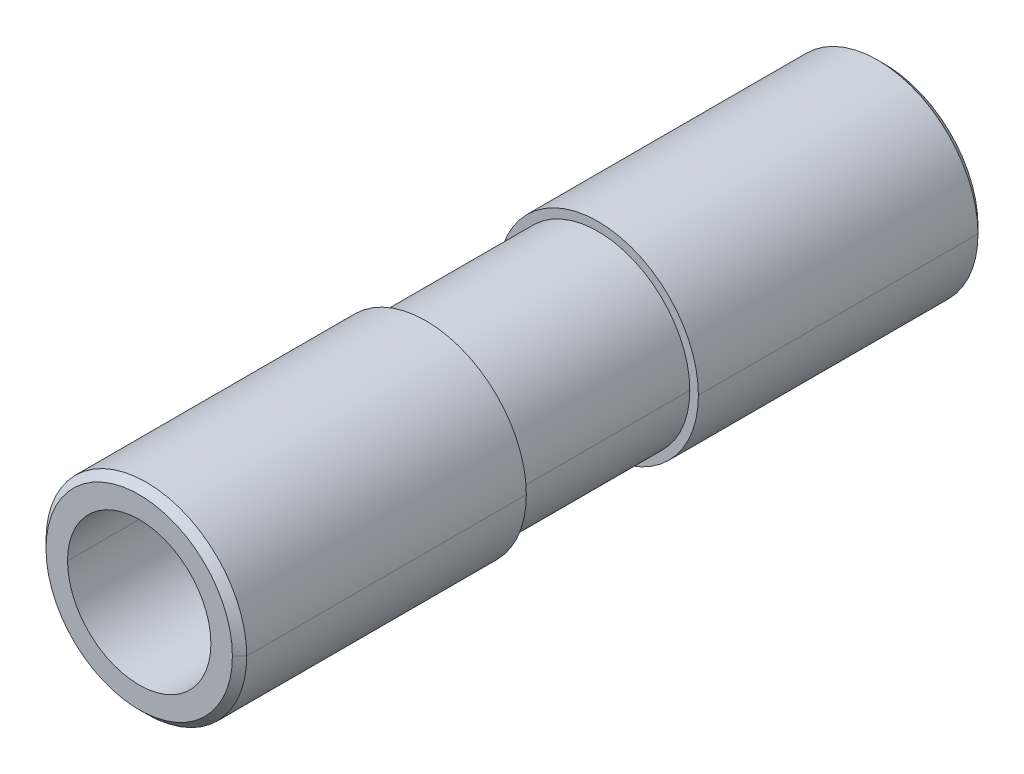
ISO-10303-21;
HEADER;
FILE_DESCRIPTION(('STEP AP214'),'2;1');
FILE_NAME('part.step','',(''),(''),'','','');
FILE_SCHEMA(('AUTOMOTIVE_DESIGN { 1 0 10303 214 1 1 1 1 }'));
ENDSEC;
DATA;
#1=APPLICATION_CONTEXT('core data for automotive mechanical design processes');
#2=APPLICATION_PROTOCOL_DEFINITION('international standard','automotive_design',2000,#1);
#3=PRODUCT_CONTEXT('',#1,'mechanical');
#4=PRODUCT('Part','Part','',(#3));
#5=PRODUCT_RELATED_PRODUCT_CATEGORY('part','',(#4));
#6=PRODUCT_DEFINITION_FORMATION('','',#4);
#7=PRODUCT_DEFINITION_CONTEXT('part definition',#1,'design');
#8=PRODUCT_DEFINITION('design','',#6,#7);
#9=PRODUCT_DEFINITION_SHAPE('','',#8);
#10=(LENGTH_UNIT() NAMED_UNIT(*) SI_UNIT(.MILLI.,.METRE.));
#11=(NAMED_UNIT(*) PLANE_ANGLE_UNIT() SI_UNIT($,.RADIAN.));
#12=(NAMED_UNIT(*) SI_UNIT($,.STERADIAN.) SOLID_ANGLE_UNIT());
#13=UNCERTAINTY_MEASURE_WITH_UNIT(LENGTH_MEASURE(1.E-05),#10,'distance_accuracy_value','');
#14=(GEOMETRIC_REPRESENTATION_CONTEXT(3) GLOBAL_UNCERTAINTY_ASSIGNED_CONTEXT((#13)) GLOBAL_UNIT_ASSIGNED_CONTEXT((#10,
#11,#12)) REPRESENTATION_CONTEXT('',''));
#15=CARTESIAN_POINT('',(0.,0.,0.));
#16=DIRECTION('',(0.,0.,1.));
#17=DIRECTION('',(1.,0.,0.));
#18=AXIS2_PLACEMENT_3D('',#15,#16,#17);
#19=CARTESIAN_POINT('',(0.,0.,13.));
#20=DIRECTION('',(0.,0.,-1.));
#21=DIRECTION('',(-1.,0.,0.));
#22=AXIS2_PLACEMENT_3D('',#19,#20,#21);
#23=CONICAL_SURFACE('',#22,3.25,0.785398163397449);
#24=CARTESIAN_POINT('',(0.,0.,13.));
#25=DIRECTION('',(0.,0.,1.));
#26=DIRECTION('',(-1.,0.,0.));
#27=AXIS2_PLACEMENT_3D('',#24,#25,#26);
#28=CIRCLE('',#27,3.25);
#29=CARTESIAN_POINT('',(3.25,0.,13.));
#30=VERTEX_POINT('',#29);
#31=CARTESIAN_POINT('',(-3.25,0.,13.));
#32=VERTEX_POINT('',#31);
#33=EDGE_CURVE('E41',#30,#32,#28,.T.);
#34=ORIENTED_EDGE('',*,*,#33,.F.);
#35=DIRECTION('',(0.707106781186548,0.,-0.707106781186547));
#36=VECTOR('',#35,1.);
#37=CARTESIAN_POINT('',(3.25,0.,13.));
#38=LINE('',#37,#36);
#39=CARTESIAN_POINT('',(3.5,0.,12.75));
#40=VERTEX_POINT('',#39);
#41=EDGE_CURVE('E11',#30,#40,#38,.T.);
#42=ORIENTED_EDGE('',*,*,#41,.T.);
#43=CARTESIAN_POINT('',(0.,0.,12.75));
#44=DIRECTION('',(0.,0.,-1.));
#45=DIRECTION('',(-1.,0.,0.));
#46=AXIS2_PLACEMENT_3D('',#43,#44,#45);
#47=CIRCLE('',#46,3.5);
#48=CARTESIAN_POINT('',(-3.5,0.,12.75));
#49=VERTEX_POINT('',#48);
#50=EDGE_CURVE('E123',#49,#40,#47,.T.);
#51=ORIENTED_EDGE('',*,*,#50,.F.);
#52=DIRECTION('',(-0.707106781186548,0.,-0.707106781186547));
#53=VECTOR('',#52,1.);
#54=CARTESIAN_POINT('',(-3.25,0.,13.));
#55=LINE('',#54,#53);
#56=EDGE_CURVE('E166',#32,#49,#55,.T.);
#57=ORIENTED_EDGE('',*,*,#56,.F.);
#58=EDGE_LOOP('',(#34,#42,#51,#57));
#59=FACE_BOUND('',#58,.T.);
#60=ADVANCED_FACE('F16',(#59),#23,.T.);
#61=CARTESIAN_POINT('',(0.,0.,-12.75));
#62=DIRECTION('',(0.,0.,1.));
#63=DIRECTION('',(1.,0.,0.));
#64=AXIS2_PLACEMENT_3D('',#61,#62,#63);
#65=CONICAL_SURFACE('',#64,3.5,0.785398163397448);
#66=CARTESIAN_POINT('',(0.,0.,-13.));
#67=DIRECTION('',(0.,0.,-1.));
#68=DIRECTION('',(1.,0.,0.));
#69=AXIS2_PLACEMENT_3D('',#66,#67,#68);
#70=CIRCLE('',#69,3.25);
#71=CARTESIAN_POINT('',(-3.25,0.,-13.));
#72=VERTEX_POINT('',#71);
#73=CARTESIAN_POINT('',(3.25,0.,-13.));
#74=VERTEX_POINT('',#73);
#75=EDGE_CURVE('E192',#72,#74,#70,.T.);
#76=ORIENTED_EDGE('',*,*,#75,.F.);
#77=DIRECTION('',(-0.707106781186548,0.,0.707106781186548));
#78=VECTOR('',#77,1.);
#79=CARTESIAN_POINT('',(-3.5,0.,-12.75));
#80=LINE('',#79,#78);
#81=CARTESIAN_POINT('',(-3.5,0.,-12.75));
#82=VERTEX_POINT('',#81);
#83=EDGE_CURVE('E27',#72,#82,#80,.T.);
#84=ORIENTED_EDGE('',*,*,#83,.T.);
#85=CARTESIAN_POINT('',(0.,0.,-12.75));
#86=DIRECTION('',(0.,0.,1.));
#87=DIRECTION('',(1.,0.,0.));
#88=AXIS2_PLACEMENT_3D('',#85,#86,#87);
#89=CIRCLE('',#88,3.5);
#90=CARTESIAN_POINT('',(3.5,0.,-12.75));
#91=VERTEX_POINT('',#90);
#92=EDGE_CURVE('E180',#91,#82,#89,.T.);
#93=ORIENTED_EDGE('',*,*,#92,.F.);
#94=DIRECTION('',(0.707106781186548,0.,0.707106781186548));
#95=VECTOR('',#94,1.);
#96=CARTESIAN_POINT('',(3.5,0.,-12.75));
#97=LINE('',#96,#95);
#98=EDGE_CURVE('E162',#74,#91,#97,.T.);
#99=ORIENTED_EDGE('',*,*,#98,.F.);
#100=EDGE_LOOP('',(#76,#84,#93,#99));
#101=FACE_BOUND('',#100,.T.);
#102=ADVANCED_FACE('F254',(#101),#65,.T.);
#103=CARTESIAN_POINT('',(0.,0.,7.75955985725057));
#104=DIRECTION('',(0.,0.,1.));
#105=DIRECTION('',(1.,0.,0.));
#106=AXIS2_PLACEMENT_3D('',#103,#104,#105);
#107=CYLINDRICAL_SURFACE('',#106,3.5);
#108=ORIENTED_EDGE('',*,*,#92,.T.);
#109=DIRECTION('',(0.,0.,1.));
#110=VECTOR('',#109,1.);
#111=CARTESIAN_POINT('',(-3.5,0.,7.75955985725057));
#112=LINE('',#111,#110);
#113=CARTESIAN_POINT('',(-3.5,0.,-3.));
#114=VERTEX_POINT('',#113);
#115=EDGE_CURVE('E209',#82,#114,#112,.T.);
#116=ORIENTED_EDGE('',*,*,#115,.T.);
#117=CARTESIAN_POINT('',(0.,0.,-3.));
#118=DIRECTION('',(0.,0.,1.));
#119=DIRECTION('',(1.,0.,0.));
#120=AXIS2_PLACEMENT_3D('',#117,#118,#119);
#121=CIRCLE('',#120,3.5);
#122=CARTESIAN_POINT('',(3.5,0.,-3.));
#123=VERTEX_POINT('',#122);
#124=EDGE_CURVE('E176',#123,#114,#121,.T.);
#125=ORIENTED_EDGE('',*,*,#124,.F.);
#126=DIRECTION('',(0.,0.,1.));
#127=VECTOR('',#126,1.);
#128=CARTESIAN_POINT('',(3.5,0.,7.75955985725057));
#129=LINE('',#128,#127);
#130=EDGE_CURVE('E172',#91,#123,#129,.T.);
#131=ORIENTED_EDGE('',*,*,#130,.F.);
#132=EDGE_LOOP('',(#108,#116,#125,#131));
#133=FACE_BOUND('',#132,.T.);
#134=ADVANCED_FACE('F248',(#133),#107,.T.);
#135=CARTESIAN_POINT('',(0.,0.,7.75955985725057));
#136=DIRECTION('',(0.,0.,1.));
#137=DIRECTION('',(1.,0.,0.));
#138=AXIS2_PLACEMENT_3D('',#135,#136,#137);
#139=CYLINDRICAL_SURFACE('',#138,3.2);
#140=CARTESIAN_POINT('',(0.,0.,-3.));
#141=DIRECTION('',(0.,0.,1.));
#142=DIRECTION('',(1.,0.,0.));
#143=AXIS2_PLACEMENT_3D('',#140,#141,#142);
#144=CIRCLE('',#143,3.2);
#145=CARTESIAN_POINT('',(3.2,0.,-3.));
#146=VERTEX_POINT('',#145);
#147=CARTESIAN_POINT('',(-3.2,0.,-3.));
#148=VERTEX_POINT('',#147);
#149=EDGE_CURVE('E213',#146,#148,#144,.T.);
#150=ORIENTED_EDGE('',*,*,#149,.T.);
#151=DIRECTION('',(0.,0.,1.));
#152=VECTOR('',#151,1.);
#153=CARTESIAN_POINT('',(-3.2,0.,7.75955985725057));
#154=LINE('',#153,#152);
#155=CARTESIAN_POINT('',(-3.2,0.,3.));
#156=VERTEX_POINT('',#155);
#157=EDGE_CURVE('E135',#148,#156,#154,.T.);
#158=ORIENTED_EDGE('',*,*,#157,.T.);
#159=CARTESIAN_POINT('',(0.,0.,3.));
#160=DIRECTION('',(0.,0.,1.));
#161=DIRECTION('',(1.,0.,0.));
#162=AXIS2_PLACEMENT_3D('',#159,#160,#161);
#163=CIRCLE('',#162,3.2);
#164=CARTESIAN_POINT('',(3.2,0.,3.));
#165=VERTEX_POINT('',#164);
#166=EDGE_CURVE('E161',#165,#156,#163,.T.);
#167=ORIENTED_EDGE('',*,*,#166,.F.);
#168=DIRECTION('',(0.,0.,1.));
#169=VECTOR('',#168,1.);
#170=CARTESIAN_POINT('',(3.2,0.,7.75955985725057));
#171=LINE('',#170,#169);
#172=EDGE_CURVE('E221',#146,#165,#171,.T.);
#173=ORIENTED_EDGE('',*,*,#172,.F.);
#174=EDGE_LOOP('',(#150,#158,#167,#173));
#175=FACE_BOUND('',#174,.T.);
#176=ADVANCED_FACE('F294',(#175),#139,.T.);
#177=CARTESIAN_POINT('',(0.,0.,7.75955985725057));
#178=DIRECTION('',(0.,0.,1.));
#179=DIRECTION('',(1.,0.,0.));
#180=AXIS2_PLACEMENT_3D('',#177,#178,#179);
#181=CYLINDRICAL_SURFACE('',#180,3.5);
#182=CARTESIAN_POINT('',(0.,0.,3.));
#183=DIRECTION('',(0.,0.,1.));
#184=DIRECTION('',(1.,0.,0.));
#185=AXIS2_PLACEMENT_3D('',#182,#183,#184);
#186=CIRCLE('',#185,3.5);
#187=CARTESIAN_POINT('',(3.5,0.,3.));
#188=VERTEX_POINT('',#187);
#189=CARTESIAN_POINT('',(-3.5,0.,3.));
#190=VERTEX_POINT('',#189);
#191=EDGE_CURVE('E120',#188,#190,#186,.T.);
#192=ORIENTED_EDGE('',*,*,#191,.T.);
#193=DIRECTION('',(0.,0.,1.));
#194=VECTOR('',#193,1.);
#195=CARTESIAN_POINT('',(-3.5,0.,7.75955985725057));
#196=LINE('',#195,#194);
#197=EDGE_CURVE('E20',#190,#49,#196,.T.);
#198=ORIENTED_EDGE('',*,*,#197,.T.);
#199=ORIENTED_EDGE('',*,*,#50,.T.);
#200=DIRECTION('',(0.,0.,1.));
#201=VECTOR('',#200,1.);
#202=CARTESIAN_POINT('',(3.5,0.,7.75955985725057));
#203=LINE('',#202,#201);
#204=EDGE_CURVE('E116',#188,#40,#203,.T.);
#205=ORIENTED_EDGE('',*,*,#204,.F.);
#206=EDGE_LOOP('',(#192,#198,#199,#205));
#207=FACE_BOUND('',#206,.T.);
#208=ADVANCED_FACE('F118',(#207),#181,.T.);
#209=CARTESIAN_POINT('',(0.,0.,7.75955985725057));
#210=DIRECTION('',(0.,0.,1.));
#211=DIRECTION('',(1.,0.,0.));
#212=AXIS2_PLACEMENT_3D('',#209,#210,#211);
#213=CYLINDRICAL_SURFACE('',#212,2.5);
#214=CARTESIAN_POINT('',(0.,0.,-13.));
#215=DIRECTION('',(0.,0.,1.));
#216=DIRECTION('',(1.,0.,0.));
#217=AXIS2_PLACEMENT_3D('',#214,#215,#216);
#218=CIRCLE('',#217,2.5);
#219=CARTESIAN_POINT('',(-2.5,0.,-13.));
#220=VERTEX_POINT('',#219);
#221=CARTESIAN_POINT('',(2.5,0.,-13.));
#222=VERTEX_POINT('',#221);
#223=EDGE_CURVE('E165',#220,#222,#218,.T.);
#224=ORIENTED_EDGE('',*,*,#223,.F.);
#225=DIRECTION('',(0.,0.,1.));
#226=VECTOR('',#225,1.);
#227=CARTESIAN_POINT('',(-2.5,0.,7.75955985725057));
#228=LINE('',#227,#226);
#229=CARTESIAN_POINT('',(-2.5,0.,13.));
#230=VERTEX_POINT('',#229);
#231=EDGE_CURVE('E214',#220,#230,#228,.T.);
#232=ORIENTED_EDGE('',*,*,#231,.T.);
#233=CARTESIAN_POINT('',(0.,0.,13.));
#234=DIRECTION('',(0.,0.,1.));
#235=DIRECTION('',(1.,0.,0.));
#236=AXIS2_PLACEMENT_3D('',#233,#234,#235);
#237=CIRCLE('',#236,2.5);
#238=CARTESIAN_POINT('',(2.5,0.,13.));
#239=VERTEX_POINT('',#238);
#240=EDGE_CURVE('E156',#230,#239,#237,.T.);
#241=ORIENTED_EDGE('',*,*,#240,.T.);
#242=DIRECTION('',(0.,0.,1.));
#243=VECTOR('',#242,1.);
#244=CARTESIAN_POINT('',(2.5,0.,7.75955985725057));
#245=LINE('',#244,#243);
#246=EDGE_CURVE('E153',#222,#239,#245,.T.);
#247=ORIENTED_EDGE('',*,*,#246,.F.);
#248=EDGE_LOOP('',(#224,#232,#241,#247));
#249=FACE_BOUND('',#248,.T.);
#250=ADVANCED_FACE('F305',(#249),#213,.F.);
#251=CARTESIAN_POINT('',(0.,0.,7.75955985725057));
#252=DIRECTION('',(0.,0.,1.));
#253=DIRECTION('',(1.,0.,0.));
#254=AXIS2_PLACEMENT_3D('',#251,#252,#253);
#255=CYLINDRICAL_SURFACE('',#254,2.5);
#256=ORIENTED_EDGE('',*,*,#231,.F.);
#257=CARTESIAN_POINT('',(0.,0.,-13.));
#258=DIRECTION('',(0.,0.,1.));
#259=DIRECTION('',(1.,0.,0.));
#260=AXIS2_PLACEMENT_3D('',#257,#258,#259);
#261=CIRCLE('',#260,2.5);
#262=EDGE_CURVE('E185',#222,#220,#261,.T.);
#263=ORIENTED_EDGE('',*,*,#262,.F.);
#264=ORIENTED_EDGE('',*,*,#246,.T.);
#265=CARTESIAN_POINT('',(0.,0.,13.));
#266=DIRECTION('',(0.,0.,1.));
#267=DIRECTION('',(1.,0.,0.));
#268=AXIS2_PLACEMENT_3D('',#265,#266,#267);
#269=CIRCLE('',#268,2.5);
#270=EDGE_CURVE('E149',#239,#230,#269,.T.);
#271=ORIENTED_EDGE('',*,*,#270,.T.);
#272=EDGE_LOOP('',(#256,#263,#264,#271));
#273=FACE_BOUND('',#272,.T.);
#274=ADVANCED_FACE('F297',(#273),#255,.F.);
#275=CARTESIAN_POINT('',(0.,2.5,13.));
#276=DIRECTION('',(0.,0.,-1.));
#277=DIRECTION('',(0.,-1.,0.));
#278=AXIS2_PLACEMENT_3D('',#275,#276,#277);
#279=PLANE('',#278);
#280=CARTESIAN_POINT('',(0.,0.,13.));
#281=DIRECTION('',(0.,0.,1.));
#282=DIRECTION('',(-1.,0.,0.));
#283=AXIS2_PLACEMENT_3D('',#280,#281,#282);
#284=CIRCLE('',#283,3.25);
#285=EDGE_CURVE('E143',#32,#30,#284,.T.);
#286=ORIENTED_EDGE('',*,*,#285,.T.);
#287=ORIENTED_EDGE('',*,*,#33,.T.);
#288=EDGE_LOOP('',(#286,#287));
#289=FACE_BOUND('',#288,.T.);
#290=ORIENTED_EDGE('',*,*,#270,.F.);
#291=ORIENTED_EDGE('',*,*,#240,.F.);
#292=EDGE_LOOP('',(#290,#291));
#293=FACE_BOUND('',#292,.T.);
#294=ADVANCED_FACE('F295',(#289,#293),#279,.F.);
#295=CARTESIAN_POINT('',(0.,0.,7.75955985725057));
#296=DIRECTION('',(0.,0.,1.));
#297=DIRECTION('',(1.,0.,0.));
#298=AXIS2_PLACEMENT_3D('',#295,#296,#297);
#299=CYLINDRICAL_SURFACE('',#298,3.5);
#300=ORIENTED_EDGE('',*,*,#197,.F.);
#301=CARTESIAN_POINT('',(0.,0.,3.));
#302=DIRECTION('',(0.,0.,1.));
#303=DIRECTION('',(1.,0.,0.));
#304=AXIS2_PLACEMENT_3D('',#301,#302,#303);
#305=CIRCLE('',#304,3.5);
#306=EDGE_CURVE('E128',#190,#188,#305,.T.);
#307=ORIENTED_EDGE('',*,*,#306,.T.);
#308=ORIENTED_EDGE('',*,*,#204,.T.);
#309=CARTESIAN_POINT('',(0.,0.,12.75));
#310=DIRECTION('',(0.,0.,-1.));
#311=DIRECTION('',(-1.,0.,0.));
#312=AXIS2_PLACEMENT_3D('',#309,#310,#311);
#313=CIRCLE('',#312,3.5);
#314=EDGE_CURVE('E129',#40,#49,#313,.T.);
#315=ORIENTED_EDGE('',*,*,#314,.T.);
#316=EDGE_LOOP('',(#300,#307,#308,#315));
#317=FACE_BOUND('',#316,.T.);
#318=ADVANCED_FACE('F136',(#317),#299,.T.);
#319=CARTESIAN_POINT('',(0.,3.5,3.));
#320=DIRECTION('',(0.,0.,1.));
#321=DIRECTION('',(1.,0.,0.));
#322=AXIS2_PLACEMENT_3D('',#319,#320,#321);
#323=PLANE('',#322);
#324=ORIENTED_EDGE('',*,*,#191,.F.);
#325=ORIENTED_EDGE('',*,*,#306,.F.);
#326=EDGE_LOOP('',(#324,#325));
#327=FACE_BOUND('',#326,.T.);
#328=ORIENTED_EDGE('',*,*,#166,.T.);
#329=CARTESIAN_POINT('',(0.,0.,3.));
#330=DIRECTION('',(0.,0.,1.));
#331=DIRECTION('',(1.,0.,0.));
#332=AXIS2_PLACEMENT_3D('',#329,#330,#331);
#333=CIRCLE('',#332,3.2);
#334=EDGE_CURVE('E157',#156,#165,#333,.T.);
#335=ORIENTED_EDGE('',*,*,#334,.T.);
#336=EDGE_LOOP('',(#328,#335));
#337=FACE_BOUND('',#336,.T.);
#338=ADVANCED_FACE('F132',(#327,#337),#323,.F.);
#339=CARTESIAN_POINT('',(0.,0.,7.75955985725057));
#340=DIRECTION('',(0.,0.,1.));
#341=DIRECTION('',(1.,0.,0.));
#342=AXIS2_PLACEMENT_3D('',#339,#340,#341);
#343=CYLINDRICAL_SURFACE('',#342,3.2);
#344=ORIENTED_EDGE('',*,*,#157,.F.);
#345=CARTESIAN_POINT('',(0.,0.,-3.));
#346=DIRECTION('',(0.,0.,1.));
#347=DIRECTION('',(1.,0.,0.));
#348=AXIS2_PLACEMENT_3D('',#345,#346,#347);
#349=CIRCLE('',#348,3.2);
#350=EDGE_CURVE('E147',#148,#146,#349,.T.);
#351=ORIENTED_EDGE('',*,*,#350,.T.);
#352=ORIENTED_EDGE('',*,*,#172,.T.);
#353=ORIENTED_EDGE('',*,*,#334,.F.);
#354=EDGE_LOOP('',(#344,#351,#352,#353));
#355=FACE_BOUND('',#354,.T.);
#356=ADVANCED_FACE('F283',(#355),#343,.T.);
#357=CARTESIAN_POINT('',(0.,3.2,-3.));
#358=DIRECTION('',(0.,0.,-1.));
#359=DIRECTION('',(0.,-1.,0.));
#360=AXIS2_PLACEMENT_3D('',#357,#358,#359);
#361=PLANE('',#360);
#362=ORIENTED_EDGE('',*,*,#124,.T.);
#363=CARTESIAN_POINT('',(0.,0.,-3.));
#364=DIRECTION('',(0.,0.,1.));
#365=DIRECTION('',(1.,0.,0.));
#366=AXIS2_PLACEMENT_3D('',#363,#364,#365);
#367=CIRCLE('',#366,3.5);
#368=EDGE_CURVE('E171',#114,#123,#367,.T.);
#369=ORIENTED_EDGE('',*,*,#368,.T.);
#370=EDGE_LOOP('',(#362,#369));
#371=FACE_BOUND('',#370,.T.);
#372=ORIENTED_EDGE('',*,*,#149,.F.);
#373=ORIENTED_EDGE('',*,*,#350,.F.);
#374=EDGE_LOOP('',(#372,#373));
#375=FACE_BOUND('',#374,.T.);
#376=ADVANCED_FACE('F243',(#371,#375),#361,.F.);
#377=CARTESIAN_POINT('',(0.,0.,7.75955985725057));
#378=DIRECTION('',(0.,0.,1.));
#379=DIRECTION('',(1.,0.,0.));
#380=AXIS2_PLACEMENT_3D('',#377,#378,#379);
#381=CYLINDRICAL_SURFACE('',#380,3.5);
#382=ORIENTED_EDGE('',*,*,#115,.F.);
#383=CARTESIAN_POINT('',(0.,0.,-12.75));
#384=DIRECTION('',(0.,0.,1.));
#385=DIRECTION('',(1.,0.,0.));
#386=AXIS2_PLACEMENT_3D('',#383,#384,#385);
#387=CIRCLE('',#386,3.5);
#388=EDGE_CURVE('E167',#82,#91,#387,.T.);
#389=ORIENTED_EDGE('',*,*,#388,.T.);
#390=ORIENTED_EDGE('',*,*,#130,.T.);
#391=ORIENTED_EDGE('',*,*,#368,.F.);
#392=EDGE_LOOP('',(#382,#389,#390,#391));
#393=FACE_BOUND('',#392,.T.);
#394=ADVANCED_FACE('F251',(#393),#381,.T.);
#395=CARTESIAN_POINT('',(0.,3.5,-13.));
#396=DIRECTION('',(0.,0.,1.));
#397=DIRECTION('',(1.,0.,0.));
#398=AXIS2_PLACEMENT_3D('',#395,#396,#397);
#399=PLANE('',#398);
#400=CARTESIAN_POINT('',(0.,0.,-13.));
#401=DIRECTION('',(0.,0.,-1.));
#402=DIRECTION('',(1.,0.,0.));
#403=AXIS2_PLACEMENT_3D('',#400,#401,#402);
#404=CIRCLE('',#403,3.25);
#405=EDGE_CURVE('E189',#74,#72,#404,.T.);
#406=ORIENTED_EDGE('',*,*,#405,.T.);
#407=ORIENTED_EDGE('',*,*,#75,.T.);
#408=EDGE_LOOP('',(#406,#407));
#409=FACE_BOUND('',#408,.T.);
#410=ORIENTED_EDGE('',*,*,#262,.T.);
#411=ORIENTED_EDGE('',*,*,#223,.T.);
#412=EDGE_LOOP('',(#410,#411));
#413=FACE_BOUND('',#412,.T.);
#414=ADVANCED_FACE('F259',(#409,#413),#399,.F.);
#415=CARTESIAN_POINT('',(0.,0.,-12.75));
#416=DIRECTION('',(0.,0.,1.));
#417=DIRECTION('',(1.,0.,0.));
#418=AXIS2_PLACEMENT_3D('',#415,#416,#417);
#419=CONICAL_SURFACE('',#418,3.5,0.785398163397448);
#420=ORIENTED_EDGE('',*,*,#83,.F.);
#421=ORIENTED_EDGE('',*,*,#405,.F.);
#422=ORIENTED_EDGE('',*,*,#98,.T.);
#423=ORIENTED_EDGE('',*,*,#388,.F.);
#424=EDGE_LOOP('',(#420,#421,#422,#423));
#425=FACE_BOUND('',#424,.T.);
#426=ADVANCED_FACE('F257',(#425),#419,.T.);
#427=CARTESIAN_POINT('',(0.,0.,13.));
#428=DIRECTION('',(0.,0.,-1.));
#429=DIRECTION('',(-1.,0.,0.));
#430=AXIS2_PLACEMENT_3D('',#427,#428,#429);
#431=CONICAL_SURFACE('',#430,3.25,0.785398163397449);
#432=ORIENTED_EDGE('',*,*,#41,.F.);
#433=ORIENTED_EDGE('',*,*,#285,.F.);
#434=ORIENTED_EDGE('',*,*,#56,.T.);
#435=ORIENTED_EDGE('',*,*,#314,.F.);
#436=EDGE_LOOP('',(#432,#433,#434,#435));
#437=FACE_BOUND('',#436,.T.);
#438=ADVANCED_FACE('F18',(#437),#431,.T.);
#439=CLOSED_SHELL('',(#60,#102,#134,#176,#208,#250,#274,#294,#318,#338,#356,#376,#394,#414,#426,#438));
#440=MANIFOLD_SOLID_BREP('B1',#439);
#441=ADVANCED_BREP_SHAPE_REPRESENTATION('',(#18,#440),#14);
#442=SHAPE_DEFINITION_REPRESENTATION(#9,#441);
ENDSEC;
END-ISO-10303-21;
